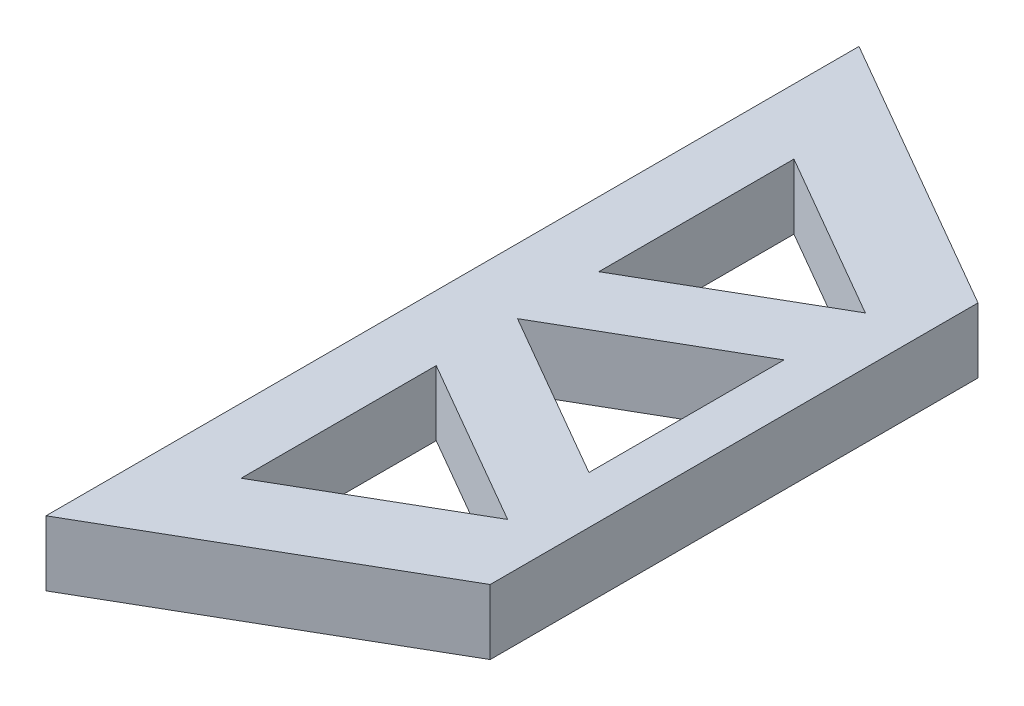
ISO-10303-21;
HEADER;
FILE_DESCRIPTION(('STEP AP214'),'2;1');
FILE_NAME('part.step','',(''),(''),'','','');
FILE_SCHEMA(('AUTOMOTIVE_DESIGN { 1 0 10303 214 1 1 1 1 }'));
ENDSEC;
DATA;
#1=APPLICATION_CONTEXT('core data for automotive mechanical design processes');
#2=APPLICATION_PROTOCOL_DEFINITION('international standard','automotive_design',2000,#1);
#3=PRODUCT_CONTEXT('',#1,'mechanical');
#4=PRODUCT('Part','Part','',(#3));
#5=PRODUCT_RELATED_PRODUCT_CATEGORY('part','',(#4));
#6=PRODUCT_DEFINITION_FORMATION('','',#4);
#7=PRODUCT_DEFINITION_CONTEXT('part definition',#1,'design');
#8=PRODUCT_DEFINITION('design','',#6,#7);
#9=PRODUCT_DEFINITION_SHAPE('','',#8);
#10=(LENGTH_UNIT() NAMED_UNIT(*) SI_UNIT(.MILLI.,.METRE.));
#11=(NAMED_UNIT(*) PLANE_ANGLE_UNIT() SI_UNIT($,.RADIAN.));
#12=(NAMED_UNIT(*) SI_UNIT($,.STERADIAN.) SOLID_ANGLE_UNIT());
#13=UNCERTAINTY_MEASURE_WITH_UNIT(LENGTH_MEASURE(1.E-05),#10,'distance_accuracy_value','');
#14=(GEOMETRIC_REPRESENTATION_CONTEXT(3) GLOBAL_UNCERTAINTY_ASSIGNED_CONTEXT((#13)) GLOBAL_UNIT_ASSIGNED_CONTEXT((#10,
#11,#12)) REPRESENTATION_CONTEXT('',''));
#15=CARTESIAN_POINT('',(0.,0.,0.));
#16=DIRECTION('',(0.,0.,1.));
#17=DIRECTION('',(1.,0.,0.));
#18=AXIS2_PLACEMENT_3D('',#15,#16,#17);
#19=CARTESIAN_POINT('',(0.,20.,0.));
#20=DIRECTION('',(0.,1.,0.));
#21=DIRECTION('',(0.,0.,1.));
#22=AXIS2_PLACEMENT_3D('',#19,#20,#21);
#23=PLANE('',#22);
#24=DIRECTION('',(0.,0.,-1.));
#25=VECTOR('',#24,1.);
#26=CARTESIAN_POINT('',(86.6025403784436,20.,-75.0000000000004));
#27=LINE('',#26,#25);
#28=CARTESIAN_POINT('',(86.6025403784436,20.,74.9999999999996));
#29=VERTEX_POINT('',#28);
#30=CARTESIAN_POINT('',(86.6025403784436,20.,-75.0000000000004));
#31=VERTEX_POINT('',#30);
#32=EDGE_CURVE('E208',#29,#31,#27,.T.);
#33=ORIENTED_EDGE('',*,*,#32,.T.);
#34=DIRECTION('',(-0.86602540378444,0.,-0.499999999999998));
#35=VECTOR('',#34,1.);
#36=CARTESIAN_POINT('',(0.,20.,-125.));
#37=LINE('',#36,#35);
#38=CARTESIAN_POINT('',(0.,20.,-125.));
#39=VERTEX_POINT('',#38);
#40=EDGE_CURVE('E211',#31,#39,#37,.T.);
#41=ORIENTED_EDGE('',*,*,#40,.T.);
#42=DIRECTION('',(0.,0.,1.));
#43=VECTOR('',#42,1.);
#44=CARTESIAN_POINT('',(0.,20.,-125.));
#45=LINE('',#44,#43);
#46=CARTESIAN_POINT('',(0.,20.,125.));
#47=VERTEX_POINT('',#46);
#48=EDGE_CURVE('E214',#39,#47,#45,.T.);
#49=ORIENTED_EDGE('',*,*,#48,.T.);
#50=DIRECTION('',(0.866025403784436,0.,-0.500000000000004));
#51=VECTOR('',#50,1.);
#52=CARTESIAN_POINT('',(0.,20.,125.));
#53=LINE('',#52,#51);
#54=EDGE_CURVE('E216',#47,#29,#53,.T.);
#55=ORIENTED_EDGE('',*,*,#54,.T.);
#56=EDGE_LOOP('',(#33,#41,#49,#55));
#57=FACE_BOUND('',#56,.T.);
#58=DIRECTION('',(-0.866025403784437,0.,-0.500000000000003));
#59=VECTOR('',#58,1.);
#60=CARTESIAN_POINT('',(20.,20.,25.));
#61=LINE('',#60,#59);
#62=CARTESIAN_POINT('',(71.9615242270661,20.,55.0000000000001));
#63=VERTEX_POINT('',#62);
#64=CARTESIAN_POINT('',(20.,20.,25.));
#65=VERTEX_POINT('',#64);
#66=EDGE_CURVE('E186',#63,#65,#61,.T.);
#67=ORIENTED_EDGE('',*,*,#66,.F.);
#68=DIRECTION('',(0.866025403784439,0.,-0.5));
#69=VECTOR('',#68,1.);
#70=CARTESIAN_POINT('',(20.,20.,85.));
#71=LINE('',#70,#69);
#72=CARTESIAN_POINT('',(20.,20.,85.));
#73=VERTEX_POINT('',#72);
#74=EDGE_CURVE('E184',#73,#63,#71,.T.);
#75=ORIENTED_EDGE('',*,*,#74,.F.);
#76=DIRECTION('',(0.,0.,1.));
#77=VECTOR('',#76,1.);
#78=CARTESIAN_POINT('',(20.,20.,85.));
#79=LINE('',#78,#77);
#80=EDGE_CURVE('E190',#65,#73,#79,.T.);
#81=ORIENTED_EDGE('',*,*,#80,.F.);
#82=EDGE_LOOP('',(#67,#75,#81));
#83=FACE_BOUND('',#82,.T.);
#84=DIRECTION('',(-0.866025403784443,0.,-0.499999999999991));
#85=VECTOR('',#84,1.);
#86=CARTESIAN_POINT('',(20.,20.,-85.));
#87=LINE('',#86,#85);
#88=CARTESIAN_POINT('',(71.961524227066,20.,-55.0000000000009));
#89=VERTEX_POINT('',#88);
#90=CARTESIAN_POINT('',(20.,20.,-85.));
#91=VERTEX_POINT('',#90);
#92=EDGE_CURVE('E162',#89,#91,#87,.T.);
#93=ORIENTED_EDGE('',*,*,#92,.F.);
#94=DIRECTION('',(0.866025403784433,0.,-0.500000000000009));
#95=VECTOR('',#94,1.);
#96=CARTESIAN_POINT('',(20.,20.,-25.0000000000004));
#97=LINE('',#96,#95);
#98=CARTESIAN_POINT('',(20.,20.,-25.0000000000004));
#99=VERTEX_POINT('',#98);
#100=EDGE_CURVE('E160',#99,#89,#97,.T.);
#101=ORIENTED_EDGE('',*,*,#100,.F.);
#102=DIRECTION('',(0.,0.,1.));
#103=VECTOR('',#102,1.);
#104=CARTESIAN_POINT('',(20.,20.,-25.0000000000004));
#105=LINE('',#104,#103);
#106=EDGE_CURVE('E166',#91,#99,#105,.T.);
#107=ORIENTED_EDGE('',*,*,#106,.F.);
#108=EDGE_LOOP('',(#93,#101,#107));
#109=FACE_BOUND('',#108,.T.);
#110=DIRECTION('',(0.,0.,-1.));
#111=VECTOR('',#110,1.);
#112=CARTESIAN_POINT('',(71.9615242270661,20.,-30.0000000000006));
#113=LINE('',#112,#111);
#114=CARTESIAN_POINT('',(71.9615242270661,20.,29.9999999999994));
#115=VERTEX_POINT('',#114);
#116=CARTESIAN_POINT('',(71.9615242270661,20.,-30.0000000000006));
#117=VERTEX_POINT('',#116);
#118=EDGE_CURVE('E141',#115,#117,#113,.T.);
#119=ORIENTED_EDGE('',*,*,#118,.F.);
#120=DIRECTION('',(0.866025403784441,0.,0.499999999999997));
#121=VECTOR('',#120,1.);
#122=CARTESIAN_POINT('',(71.9615242270661,20.,29.9999999999994));
#123=LINE('',#122,#121);
#124=CARTESIAN_POINT('',(20.,20.,-2.15105711021124E-13));
#125=VERTEX_POINT('',#124);
#126=EDGE_CURVE('E133',#125,#115,#123,.T.);
#127=ORIENTED_EDGE('',*,*,#126,.F.);
#128=DIRECTION('',(-0.866025403784435,0.,0.500000000000007));
#129=VECTOR('',#128,1.);
#130=CARTESIAN_POINT('',(20.,20.,-2.15105711021124E-13));
#131=LINE('',#130,#129);
#132=EDGE_CURVE('E150',#117,#125,#131,.T.);
#133=ORIENTED_EDGE('',*,*,#132,.F.);
#134=EDGE_LOOP('',(#119,#127,#133));
#135=FACE_BOUND('',#134,.T.);
#136=ADVANCED_FACE('F38',(#57,#83,#109,#135),#23,.T.);
#137=CARTESIAN_POINT('',(0.,0.,0.));
#138=DIRECTION('',(0.,1.,0.));
#139=DIRECTION('',(0.,0.,1.));
#140=AXIS2_PLACEMENT_3D('',#137,#138,#139);
#141=PLANE('',#140);
#142=DIRECTION('',(0.866025403784433,0.,-0.500000000000009));
#143=VECTOR('',#142,1.);
#144=CARTESIAN_POINT('',(20.,0.,-25.0000000000004));
#145=LINE('',#144,#143);
#146=CARTESIAN_POINT('',(20.,0.,-25.0000000000004));
#147=VERTEX_POINT('',#146);
#148=CARTESIAN_POINT('',(71.961524227066,0.,-55.0000000000009));
#149=VERTEX_POINT('',#148);
#150=EDGE_CURVE('E148',#147,#149,#145,.T.);
#151=ORIENTED_EDGE('',*,*,#150,.T.);
#152=DIRECTION('',(-0.866025403784443,0.,-0.499999999999991));
#153=VECTOR('',#152,1.);
#154=CARTESIAN_POINT('',(20.,0.,-85.));
#155=LINE('',#154,#153);
#156=CARTESIAN_POINT('',(20.,0.,-85.));
#157=VERTEX_POINT('',#156);
#158=EDGE_CURVE('E171',#149,#157,#155,.T.);
#159=ORIENTED_EDGE('',*,*,#158,.T.);
#160=DIRECTION('',(0.,0.,1.));
#161=VECTOR('',#160,1.);
#162=CARTESIAN_POINT('',(20.,0.,-25.0000000000004));
#163=LINE('',#162,#161);
#164=EDGE_CURVE('E163',#157,#147,#163,.T.);
#165=ORIENTED_EDGE('',*,*,#164,.T.);
#166=EDGE_LOOP('',(#151,#159,#165));
#167=FACE_BOUND('',#166,.T.);
#168=DIRECTION('',(0.,0.,-1.));
#169=VECTOR('',#168,1.);
#170=CARTESIAN_POINT('',(86.6025403784436,0.,-75.0000000000004));
#171=LINE('',#170,#169);
#172=CARTESIAN_POINT('',(86.6025403784436,0.,74.9999999999996));
#173=VERTEX_POINT('',#172);
#174=CARTESIAN_POINT('',(86.6025403784436,0.,-75.0000000000004));
#175=VERTEX_POINT('',#174);
#176=EDGE_CURVE('E207',#173,#175,#171,.T.);
#177=ORIENTED_EDGE('',*,*,#176,.F.);
#178=DIRECTION('',(0.866025403784436,0.,-0.500000000000004));
#179=VECTOR('',#178,1.);
#180=CARTESIAN_POINT('',(0.,0.,125.));
#181=LINE('',#180,#179);
#182=CARTESIAN_POINT('',(0.,0.,125.));
#183=VERTEX_POINT('',#182);
#184=EDGE_CURVE('E212',#183,#173,#181,.T.);
#185=ORIENTED_EDGE('',*,*,#184,.F.);
#186=DIRECTION('',(0.,0.,1.));
#187=VECTOR('',#186,1.);
#188=CARTESIAN_POINT('',(0.,0.,-125.));
#189=LINE('',#188,#187);
#190=CARTESIAN_POINT('',(0.,0.,-125.));
#191=VERTEX_POINT('',#190);
#192=EDGE_CURVE('E223',#191,#183,#189,.T.);
#193=ORIENTED_EDGE('',*,*,#192,.F.);
#194=DIRECTION('',(-0.86602540378444,0.,-0.499999999999998));
#195=VECTOR('',#194,1.);
#196=CARTESIAN_POINT('',(0.,0.,-125.));
#197=LINE('',#196,#195);
#198=EDGE_CURVE('E221',#175,#191,#197,.T.);
#199=ORIENTED_EDGE('',*,*,#198,.F.);
#200=EDGE_LOOP('',(#177,#185,#193,#199));
#201=FACE_BOUND('',#200,.T.);
#202=DIRECTION('',(0.866025403784439,0.,-0.5));
#203=VECTOR('',#202,1.);
#204=CARTESIAN_POINT('',(20.,0.,85.));
#205=LINE('',#204,#203);
#206=CARTESIAN_POINT('',(20.,0.,85.));
#207=VERTEX_POINT('',#206);
#208=CARTESIAN_POINT('',(71.9615242270661,0.,55.0000000000001));
#209=VERTEX_POINT('',#208);
#210=EDGE_CURVE('E183',#207,#209,#205,.T.);
#211=ORIENTED_EDGE('',*,*,#210,.T.);
#212=DIRECTION('',(-0.866025403784437,0.,-0.500000000000003));
#213=VECTOR('',#212,1.);
#214=CARTESIAN_POINT('',(20.,0.,25.));
#215=LINE('',#214,#213);
#216=CARTESIAN_POINT('',(20.,0.,25.));
#217=VERTEX_POINT('',#216);
#218=EDGE_CURVE('E195',#209,#217,#215,.T.);
#219=ORIENTED_EDGE('',*,*,#218,.T.);
#220=DIRECTION('',(0.,0.,1.));
#221=VECTOR('',#220,1.);
#222=CARTESIAN_POINT('',(20.,0.,85.));
#223=LINE('',#222,#221);
#224=EDGE_CURVE('E187',#217,#207,#223,.T.);
#225=ORIENTED_EDGE('',*,*,#224,.T.);
#226=EDGE_LOOP('',(#211,#219,#225));
#227=FACE_BOUND('',#226,.T.);
#228=DIRECTION('',(0.866025403784441,0.,0.499999999999997));
#229=VECTOR('',#228,1.);
#230=CARTESIAN_POINT('',(71.9615242270661,0.,29.9999999999994));
#231=LINE('',#230,#229);
#232=CARTESIAN_POINT('',(20.,0.,-2.15105711021124E-13));
#233=VERTEX_POINT('',#232);
#234=CARTESIAN_POINT('',(71.9615242270661,0.,29.9999999999994));
#235=VERTEX_POINT('',#234);
#236=EDGE_CURVE('E61',#233,#235,#231,.T.);
#237=ORIENTED_EDGE('',*,*,#236,.T.);
#238=DIRECTION('',(0.,0.,-1.));
#239=VECTOR('',#238,1.);
#240=CARTESIAN_POINT('',(71.9615242270661,0.,-30.0000000000006));
#241=LINE('',#240,#239);
#242=CARTESIAN_POINT('',(71.9615242270661,0.,-30.0000000000006));
#243=VERTEX_POINT('',#242);
#244=EDGE_CURVE('E147',#235,#243,#241,.T.);
#245=ORIENTED_EDGE('',*,*,#244,.T.);
#246=DIRECTION('',(-0.866025403784435,0.,0.500000000000007));
#247=VECTOR('',#246,1.);
#248=CARTESIAN_POINT('',(20.,0.,-2.15105711021124E-13));
#249=LINE('',#248,#247);
#250=EDGE_CURVE('E142',#243,#233,#249,.T.);
#251=ORIENTED_EDGE('',*,*,#250,.T.);
#252=EDGE_LOOP('',(#237,#245,#251));
#253=FACE_BOUND('',#252,.T.);
#254=ADVANCED_FACE('F241',(#167,#201,#227,#253),#141,.F.);
#255=CARTESIAN_POINT('',(86.6025403784436,20.,-75.0000000000004));
#256=DIRECTION('',(-1.,0.,0.));
#257=DIRECTION('',(0.,0.,1.));
#258=AXIS2_PLACEMENT_3D('',#255,#256,#257);
#259=PLANE('',#258);
#260=ORIENTED_EDGE('',*,*,#176,.T.);
#261=DIRECTION('',(0.,-1.,0.));
#262=VECTOR('',#261,1.);
#263=CARTESIAN_POINT('',(86.6025403784436,20.,-75.0000000000004));
#264=LINE('',#263,#262);
#265=EDGE_CURVE('E11',#31,#175,#264,.T.);
#266=ORIENTED_EDGE('',*,*,#265,.F.);
#267=ORIENTED_EDGE('',*,*,#32,.F.);
#268=DIRECTION('',(0.,-1.,0.));
#269=VECTOR('',#268,1.);
#270=CARTESIAN_POINT('',(86.6025403784436,20.,74.9999999999996));
#271=LINE('',#270,#269);
#272=EDGE_CURVE('E218',#29,#173,#271,.T.);
#273=ORIENTED_EDGE('',*,*,#272,.T.);
#274=EDGE_LOOP('',(#260,#266,#267,#273));
#275=FACE_BOUND('',#274,.T.);
#276=ADVANCED_FACE('F40',(#275),#259,.F.);
#277=CARTESIAN_POINT('',(0.,20.,-125.));
#278=DIRECTION('',(-0.499999999999998,0.,0.86602540378444));
#279=DIRECTION('',(0.86602540378444,0.,0.499999999999998));
#280=AXIS2_PLACEMENT_3D('',#277,#278,#279);
#281=PLANE('',#280);
#282=ORIENTED_EDGE('',*,*,#198,.T.);
#283=DIRECTION('',(0.,-1.,0.));
#284=VECTOR('',#283,1.);
#285=CARTESIAN_POINT('',(0.,20.,-125.));
#286=LINE('',#285,#284);
#287=EDGE_CURVE('E46',#39,#191,#286,.T.);
#288=ORIENTED_EDGE('',*,*,#287,.F.);
#289=ORIENTED_EDGE('',*,*,#40,.F.);
#290=ORIENTED_EDGE('',*,*,#265,.T.);
#291=EDGE_LOOP('',(#282,#288,#289,#290));
#292=FACE_BOUND('',#291,.T.);
#293=ADVANCED_FACE('F252',(#292),#281,.F.);
#294=CARTESIAN_POINT('',(0.,20.,-125.));
#295=DIRECTION('',(1.,0.,0.));
#296=DIRECTION('',(0.,0.,-1.));
#297=AXIS2_PLACEMENT_3D('',#294,#295,#296);
#298=PLANE('',#297);
#299=ORIENTED_EDGE('',*,*,#192,.T.);
#300=DIRECTION('',(0.,-1.,0.));
#301=VECTOR('',#300,1.);
#302=CARTESIAN_POINT('',(0.,20.,125.));
#303=LINE('',#302,#301);
#304=EDGE_CURVE('E228',#47,#183,#303,.T.);
#305=ORIENTED_EDGE('',*,*,#304,.F.);
#306=ORIENTED_EDGE('',*,*,#48,.F.);
#307=ORIENTED_EDGE('',*,*,#287,.T.);
#308=EDGE_LOOP('',(#299,#305,#306,#307));
#309=FACE_BOUND('',#308,.T.);
#310=ADVANCED_FACE('F235',(#309),#298,.F.);
#311=CARTESIAN_POINT('',(0.,20.,125.));
#312=DIRECTION('',(-0.500000000000004,0.,-0.866025403784436));
#313=DIRECTION('',(-0.866025403784436,0.,0.500000000000004));
#314=AXIS2_PLACEMENT_3D('',#311,#312,#313);
#315=PLANE('',#314);
#316=ORIENTED_EDGE('',*,*,#184,.T.);
#317=ORIENTED_EDGE('',*,*,#272,.F.);
#318=ORIENTED_EDGE('',*,*,#54,.F.);
#319=ORIENTED_EDGE('',*,*,#304,.T.);
#320=EDGE_LOOP('',(#316,#317,#318,#319));
#321=FACE_BOUND('',#320,.T.);
#322=ADVANCED_FACE('F245',(#321),#315,.F.);
#323=CARTESIAN_POINT('',(20.,20.,85.));
#324=DIRECTION('',(-0.5,0.,-0.866025403784439));
#325=DIRECTION('',(-0.866025403784439,0.,0.5));
#326=AXIS2_PLACEMENT_3D('',#323,#324,#325);
#327=PLANE('',#326);
#328=ORIENTED_EDGE('',*,*,#210,.F.);
#329=DIRECTION('',(0.,-1.,0.));
#330=VECTOR('',#329,1.);
#331=CARTESIAN_POINT('',(20.,20.,85.));
#332=LINE('',#331,#330);
#333=EDGE_CURVE('E192',#73,#207,#332,.T.);
#334=ORIENTED_EDGE('',*,*,#333,.F.);
#335=ORIENTED_EDGE('',*,*,#74,.T.);
#336=DIRECTION('',(0.,-1.,0.));
#337=VECTOR('',#336,1.);
#338=CARTESIAN_POINT('',(71.9615242270661,20.,55.0000000000001));
#339=LINE('',#338,#337);
#340=EDGE_CURVE('E204',#63,#209,#339,.T.);
#341=ORIENTED_EDGE('',*,*,#340,.T.);
#342=EDGE_LOOP('',(#328,#334,#335,#341));
#343=FACE_BOUND('',#342,.T.);
#344=ADVANCED_FACE('F267',(#343),#327,.T.);
#345=CARTESIAN_POINT('',(20.,20.,25.));
#346=DIRECTION('',(-0.500000000000003,0.,0.866025403784437));
#347=DIRECTION('',(0.866025403784437,0.,0.500000000000003));
#348=AXIS2_PLACEMENT_3D('',#345,#346,#347);
#349=PLANE('',#348);
#350=ORIENTED_EDGE('',*,*,#218,.F.);
#351=ORIENTED_EDGE('',*,*,#340,.F.);
#352=ORIENTED_EDGE('',*,*,#66,.T.);
#353=DIRECTION('',(0.,-1.,0.));
#354=VECTOR('',#353,1.);
#355=CARTESIAN_POINT('',(20.,20.,25.));
#356=LINE('',#355,#354);
#357=EDGE_CURVE('E202',#65,#217,#356,.T.);
#358=ORIENTED_EDGE('',*,*,#357,.T.);
#359=EDGE_LOOP('',(#350,#351,#352,#358));
#360=FACE_BOUND('',#359,.T.);
#361=ADVANCED_FACE('F274',(#360),#349,.T.);
#362=CARTESIAN_POINT('',(20.,20.,85.));
#363=DIRECTION('',(1.,0.,0.));
#364=DIRECTION('',(0.,0.,-1.));
#365=AXIS2_PLACEMENT_3D('',#362,#363,#364);
#366=PLANE('',#365);
#367=ORIENTED_EDGE('',*,*,#224,.F.);
#368=ORIENTED_EDGE('',*,*,#357,.F.);
#369=ORIENTED_EDGE('',*,*,#80,.T.);
#370=ORIENTED_EDGE('',*,*,#333,.T.);
#371=EDGE_LOOP('',(#367,#368,#369,#370));
#372=FACE_BOUND('',#371,.T.);
#373=ADVANCED_FACE('F279',(#372),#366,.T.);
#374=CARTESIAN_POINT('',(20.,20.,-25.0000000000004));
#375=DIRECTION('',(-0.500000000000009,0.,-0.866025403784434));
#376=DIRECTION('',(-0.866025403784434,0.,0.500000000000009));
#377=AXIS2_PLACEMENT_3D('',#374,#375,#376);
#378=PLANE('',#377);
#379=ORIENTED_EDGE('',*,*,#150,.F.);
#380=DIRECTION('',(0.,-1.,0.));
#381=VECTOR('',#380,1.);
#382=CARTESIAN_POINT('',(20.,20.,-25.0000000000004));
#383=LINE('',#382,#381);
#384=EDGE_CURVE('E168',#99,#147,#383,.T.);
#385=ORIENTED_EDGE('',*,*,#384,.F.);
#386=ORIENTED_EDGE('',*,*,#100,.T.);
#387=DIRECTION('',(0.,-1.,0.));
#388=VECTOR('',#387,1.);
#389=CARTESIAN_POINT('',(71.961524227066,20.,-55.0000000000009));
#390=LINE('',#389,#388);
#391=EDGE_CURVE('E180',#89,#149,#390,.T.);
#392=ORIENTED_EDGE('',*,*,#391,.T.);
#393=EDGE_LOOP('',(#379,#385,#386,#392));
#394=FACE_BOUND('',#393,.T.);
#395=ADVANCED_FACE('F298',(#394),#378,.T.);
#396=CARTESIAN_POINT('',(20.,20.,-85.));
#397=DIRECTION('',(-0.499999999999991,0.,0.866025403784443));
#398=DIRECTION('',(0.866025403784444,0.,0.499999999999992));
#399=AXIS2_PLACEMENT_3D('',#396,#397,#398);
#400=PLANE('',#399);
#401=ORIENTED_EDGE('',*,*,#158,.F.);
#402=ORIENTED_EDGE('',*,*,#391,.F.);
#403=ORIENTED_EDGE('',*,*,#92,.T.);
#404=DIRECTION('',(0.,-1.,0.));
#405=VECTOR('',#404,1.);
#406=CARTESIAN_POINT('',(20.,20.,-85.));
#407=LINE('',#406,#405);
#408=EDGE_CURVE('E178',#91,#157,#407,.T.);
#409=ORIENTED_EDGE('',*,*,#408,.T.);
#410=EDGE_LOOP('',(#401,#402,#403,#409));
#411=FACE_BOUND('',#410,.T.);
#412=ADVANCED_FACE('F295',(#411),#400,.T.);
#413=CARTESIAN_POINT('',(20.,20.,-25.0000000000004));
#414=DIRECTION('',(1.,0.,0.));
#415=DIRECTION('',(0.,0.,-1.));
#416=AXIS2_PLACEMENT_3D('',#413,#414,#415);
#417=PLANE('',#416);
#418=ORIENTED_EDGE('',*,*,#164,.F.);
#419=ORIENTED_EDGE('',*,*,#408,.F.);
#420=ORIENTED_EDGE('',*,*,#106,.T.);
#421=ORIENTED_EDGE('',*,*,#384,.T.);
#422=EDGE_LOOP('',(#418,#419,#420,#421));
#423=FACE_BOUND('',#422,.T.);
#424=ADVANCED_FACE('F301',(#423),#417,.T.);
#425=CARTESIAN_POINT('',(71.9615242270661,20.,29.9999999999994));
#426=DIRECTION('',(0.499999999999997,0.,-0.866025403784441));
#427=DIRECTION('',(-0.866025403784441,0.,-0.499999999999997));
#428=AXIS2_PLACEMENT_3D('',#425,#426,#427);
#429=PLANE('',#428);
#430=ORIENTED_EDGE('',*,*,#236,.F.);
#431=DIRECTION('',(0.,-1.,0.));
#432=VECTOR('',#431,1.);
#433=CARTESIAN_POINT('',(20.,20.,-2.15105711021124E-13));
#434=LINE('',#433,#432);
#435=EDGE_CURVE('E137',#125,#233,#434,.T.);
#436=ORIENTED_EDGE('',*,*,#435,.F.);
#437=ORIENTED_EDGE('',*,*,#126,.T.);
#438=DIRECTION('',(0.,-1.,0.));
#439=VECTOR('',#438,1.);
#440=CARTESIAN_POINT('',(71.9615242270661,20.,29.9999999999994));
#441=LINE('',#440,#439);
#442=EDGE_CURVE('E136',#115,#235,#441,.T.);
#443=ORIENTED_EDGE('',*,*,#442,.T.);
#444=EDGE_LOOP('',(#430,#436,#437,#443));
#445=FACE_BOUND('',#444,.T.);
#446=ADVANCED_FACE('F135',(#445),#429,.T.);
#447=CARTESIAN_POINT('',(71.9615242270661,20.,-30.0000000000006));
#448=DIRECTION('',(-1.,0.,0.));
#449=DIRECTION('',(0.,0.,1.));
#450=AXIS2_PLACEMENT_3D('',#447,#448,#449);
#451=PLANE('',#450);
#452=ORIENTED_EDGE('',*,*,#244,.F.);
#453=ORIENTED_EDGE('',*,*,#442,.F.);
#454=ORIENTED_EDGE('',*,*,#118,.T.);
#455=DIRECTION('',(0.,-1.,0.));
#456=VECTOR('',#455,1.);
#457=CARTESIAN_POINT('',(71.9615242270661,20.,-30.0000000000006));
#458=LINE('',#457,#456);
#459=EDGE_CURVE('E53',#117,#243,#458,.T.);
#460=ORIENTED_EDGE('',*,*,#459,.T.);
#461=EDGE_LOOP('',(#452,#453,#454,#460));
#462=FACE_BOUND('',#461,.T.);
#463=ADVANCED_FACE('F145',(#462),#451,.T.);
#464=CARTESIAN_POINT('',(20.,20.,-2.15105711021124E-13));
#465=DIRECTION('',(0.500000000000007,0.,0.866025403784435));
#466=DIRECTION('',(0.866025403784435,0.,-0.500000000000007));
#467=AXIS2_PLACEMENT_3D('',#464,#465,#466);
#468=PLANE('',#467);
#469=ORIENTED_EDGE('',*,*,#250,.F.);
#470=ORIENTED_EDGE('',*,*,#459,.F.);
#471=ORIENTED_EDGE('',*,*,#132,.T.);
#472=ORIENTED_EDGE('',*,*,#435,.T.);
#473=EDGE_LOOP('',(#469,#470,#471,#472));
#474=FACE_BOUND('',#473,.T.);
#475=ADVANCED_FACE('F340',(#474),#468,.T.);
#476=CLOSED_SHELL('',(#136,#254,#276,#293,#310,#322,#344,#361,#373,#395,#412,#424,#446,#463,#475));
#477=MANIFOLD_SOLID_BREP('B2',#476);
#478=ADVANCED_BREP_SHAPE_REPRESENTATION('',(#18,#477),#14);
#479=SHAPE_DEFINITION_REPRESENTATION(#9,#478);
ENDSEC;
END-ISO-10303-21;
